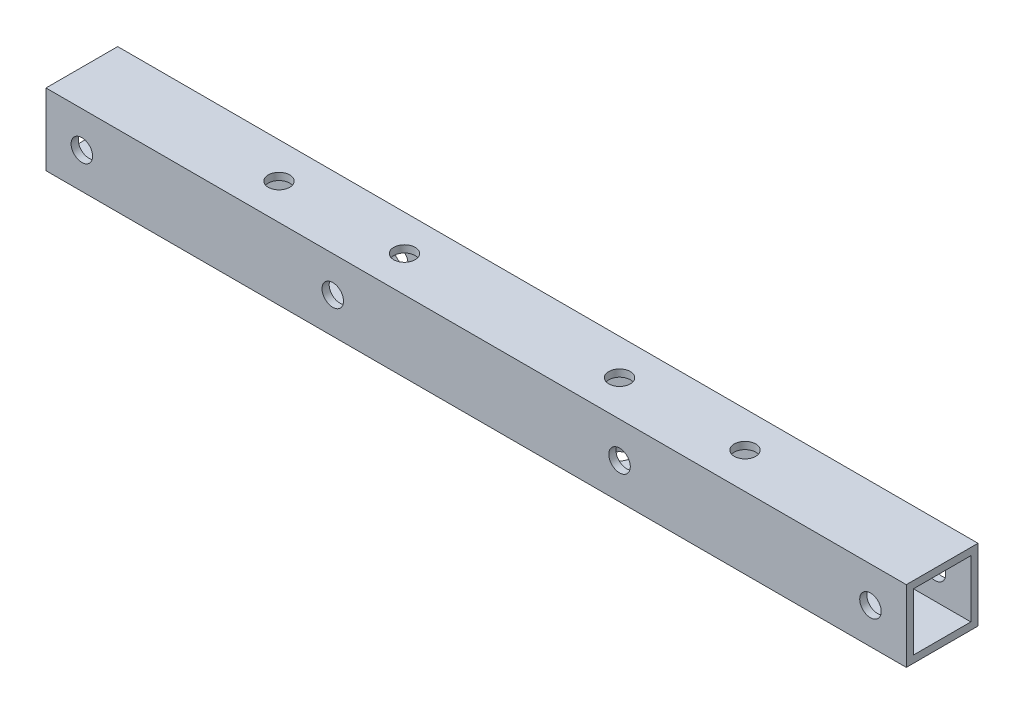
ISO-10303-21;
HEADER;
FILE_DESCRIPTION(('STEP AP214'),'2;1');
FILE_NAME('part.step','',(''),(''),'','','');
FILE_SCHEMA(('AUTOMOTIVE_DESIGN { 1 0 10303 214 1 1 1 1 }'));
ENDSEC;
DATA;
#1=APPLICATION_CONTEXT('core data for automotive mechanical design processes');
#2=APPLICATION_PROTOCOL_DEFINITION('international standard','automotive_design',2000,#1);
#3=PRODUCT_CONTEXT('',#1,'mechanical');
#4=PRODUCT('Part','Part','',(#3));
#5=PRODUCT_RELATED_PRODUCT_CATEGORY('part','',(#4));
#6=PRODUCT_DEFINITION_FORMATION('','',#4);
#7=PRODUCT_DEFINITION_CONTEXT('part definition',#1,'design');
#8=PRODUCT_DEFINITION('design','',#6,#7);
#9=PRODUCT_DEFINITION_SHAPE('','',#8);
#10=(LENGTH_UNIT() NAMED_UNIT(*) SI_UNIT(.MILLI.,.METRE.));
#11=(NAMED_UNIT(*) PLANE_ANGLE_UNIT() SI_UNIT($,.RADIAN.));
#12=(NAMED_UNIT(*) SI_UNIT($,.STERADIAN.) SOLID_ANGLE_UNIT());
#13=UNCERTAINTY_MEASURE_WITH_UNIT(LENGTH_MEASURE(1.E-05),#10,'distance_accuracy_value','');
#14=(GEOMETRIC_REPRESENTATION_CONTEXT(3) GLOBAL_UNCERTAINTY_ASSIGNED_CONTEXT((#13)) GLOBAL_UNIT_ASSIGNED_CONTEXT((#10,
#11,#12)) REPRESENTATION_CONTEXT('',''));
#15=CARTESIAN_POINT('',(0.,0.,0.));
#16=DIRECTION('',(0.,0.,1.));
#17=DIRECTION('',(1.,0.,0.));
#18=AXIS2_PLACEMENT_3D('',#15,#16,#17);
#19=CARTESIAN_POINT('',(120.,0.,0.));
#20=DIRECTION('',(1.,0.,0.));
#21=DIRECTION('',(0.,0.,-1.));
#22=AXIS2_PLACEMENT_3D('',#19,#20,#21);
#23=PLANE('',#22);
#24=DIRECTION('',(0.,1.,0.));
#25=VECTOR('',#24,1.);
#26=CARTESIAN_POINT('',(120.,-5.,-5.));
#27=LINE('',#26,#25);
#28=CARTESIAN_POINT('',(120.,-5.,-5.));
#29=VERTEX_POINT('',#28);
#30=CARTESIAN_POINT('',(120.,5.,-5.));
#31=VERTEX_POINT('',#30);
#32=EDGE_CURVE('E164',#29,#31,#27,.T.);
#33=ORIENTED_EDGE('',*,*,#32,.T.);
#34=DIRECTION('',(0.,0.,1.));
#35=VECTOR('',#34,1.);
#36=CARTESIAN_POINT('',(120.,5.,5.));
#37=LINE('',#36,#35);
#38=CARTESIAN_POINT('',(120.,5.,5.));
#39=VERTEX_POINT('',#38);
#40=EDGE_CURVE('E167',#31,#39,#37,.T.);
#41=ORIENTED_EDGE('',*,*,#40,.T.);
#42=DIRECTION('',(0.,-1.,0.));
#43=VECTOR('',#42,1.);
#44=CARTESIAN_POINT('',(120.,-5.,5.));
#45=LINE('',#44,#43);
#46=CARTESIAN_POINT('',(120.,-5.,5.));
#47=VERTEX_POINT('',#46);
#48=EDGE_CURVE('E170',#39,#47,#45,.T.);
#49=ORIENTED_EDGE('',*,*,#48,.T.);
#50=DIRECTION('',(0.,0.,-1.));
#51=VECTOR('',#50,1.);
#52=CARTESIAN_POINT('',(120.,-5.,5.));
#53=LINE('',#52,#51);
#54=EDGE_CURVE('E172',#47,#29,#53,.T.);
#55=ORIENTED_EDGE('',*,*,#54,.T.);
#56=EDGE_LOOP('',(#33,#41,#49,#55));
#57=FACE_BOUND('',#56,.T.);
#58=DIRECTION('',(0.,0.,1.));
#59=VECTOR('',#58,1.);
#60=CARTESIAN_POINT('',(120.,4.,0.));
#61=LINE('',#60,#59);
#62=CARTESIAN_POINT('',(120.,4.,-4.));
#63=VERTEX_POINT('',#62);
#64=CARTESIAN_POINT('',(120.,4.,4.));
#65=VERTEX_POINT('',#64);
#66=EDGE_CURVE('E134',#63,#65,#61,.T.);
#67=ORIENTED_EDGE('',*,*,#66,.F.);
#68=DIRECTION('',(0.,1.,0.));
#69=VECTOR('',#68,1.);
#70=CARTESIAN_POINT('',(120.,0.,-4.));
#71=LINE('',#70,#69);
#72=CARTESIAN_POINT('',(120.,-4.,-4.));
#73=VERTEX_POINT('',#72);
#74=EDGE_CURVE('E126',#73,#63,#71,.T.);
#75=ORIENTED_EDGE('',*,*,#74,.F.);
#76=DIRECTION('',(0.,0.,-1.));
#77=VECTOR('',#76,1.);
#78=CARTESIAN_POINT('',(120.,-4.,0.));
#79=LINE('',#78,#77);
#80=CARTESIAN_POINT('',(120.,-4.,4.));
#81=VERTEX_POINT('',#80);
#82=EDGE_CURVE('E148',#81,#73,#79,.T.);
#83=ORIENTED_EDGE('',*,*,#82,.F.);
#84=DIRECTION('',(0.,-1.,0.));
#85=VECTOR('',#84,1.);
#86=CARTESIAN_POINT('',(120.,0.,4.));
#87=LINE('',#86,#85);
#88=EDGE_CURVE('E146',#65,#81,#87,.T.);
#89=ORIENTED_EDGE('',*,*,#88,.F.);
#90=EDGE_LOOP('',(#67,#75,#83,#89));
#91=FACE_BOUND('',#90,.T.);
#92=ADVANCED_FACE('F59',(#57,#91),#23,.T.);
#93=CARTESIAN_POINT('',(0.,0.,0.));
#94=DIRECTION('',(1.,0.,0.));
#95=DIRECTION('',(0.,0.,-1.));
#96=AXIS2_PLACEMENT_3D('',#93,#94,#95);
#97=PLANE('',#96);
#98=DIRECTION('',(0.,1.,0.));
#99=VECTOR('',#98,1.);
#100=CARTESIAN_POINT('',(0.,-5.,-5.));
#101=LINE('',#100,#99);
#102=CARTESIAN_POINT('',(0.,-5.,-5.));
#103=VERTEX_POINT('',#102);
#104=CARTESIAN_POINT('',(0.,5.,-5.));
#105=VERTEX_POINT('',#104);
#106=EDGE_CURVE('E142',#103,#105,#101,.T.);
#107=ORIENTED_EDGE('',*,*,#106,.F.);
#108=DIRECTION('',(0.,0.,-1.));
#109=VECTOR('',#108,1.);
#110=CARTESIAN_POINT('',(0.,-5.,5.));
#111=LINE('',#110,#109);
#112=CARTESIAN_POINT('',(0.,-5.,5.));
#113=VERTEX_POINT('',#112);
#114=EDGE_CURVE('E168',#113,#103,#111,.T.);
#115=ORIENTED_EDGE('',*,*,#114,.F.);
#116=DIRECTION('',(0.,-1.,0.));
#117=VECTOR('',#116,1.);
#118=CARTESIAN_POINT('',(0.,-5.,5.));
#119=LINE('',#118,#117);
#120=CARTESIAN_POINT('',(0.,5.,5.));
#121=VERTEX_POINT('',#120);
#122=EDGE_CURVE('E179',#121,#113,#119,.T.);
#123=ORIENTED_EDGE('',*,*,#122,.F.);
#124=DIRECTION('',(0.,0.,1.));
#125=VECTOR('',#124,1.);
#126=CARTESIAN_POINT('',(0.,5.,5.));
#127=LINE('',#126,#125);
#128=EDGE_CURVE('E177',#105,#121,#127,.T.);
#129=ORIENTED_EDGE('',*,*,#128,.F.);
#130=EDGE_LOOP('',(#107,#115,#123,#129));
#131=FACE_BOUND('',#130,.T.);
#132=DIRECTION('',(0.,1.,0.));
#133=VECTOR('',#132,1.);
#134=CARTESIAN_POINT('',(0.,0.,-4.));
#135=LINE('',#134,#133);
#136=CARTESIAN_POINT('',(0.,-4.,-4.));
#137=VERTEX_POINT('',#136);
#138=CARTESIAN_POINT('',(0.,4.,-4.));
#139=VERTEX_POINT('',#138);
#140=EDGE_CURVE('E84',#137,#139,#135,.T.);
#141=ORIENTED_EDGE('',*,*,#140,.T.);
#142=DIRECTION('',(0.,0.,1.));
#143=VECTOR('',#142,1.);
#144=CARTESIAN_POINT('',(0.,4.,0.));
#145=LINE('',#144,#143);
#146=CARTESIAN_POINT('',(0.,4.,4.));
#147=VERTEX_POINT('',#146);
#148=EDGE_CURVE('E141',#139,#147,#145,.T.);
#149=ORIENTED_EDGE('',*,*,#148,.T.);
#150=DIRECTION('',(0.,-1.,0.));
#151=VECTOR('',#150,1.);
#152=CARTESIAN_POINT('',(0.,0.,4.));
#153=LINE('',#152,#151);
#154=CARTESIAN_POINT('',(0.,-4.,4.));
#155=VERTEX_POINT('',#154);
#156=EDGE_CURVE('E156',#147,#155,#153,.T.);
#157=ORIENTED_EDGE('',*,*,#156,.T.);
#158=DIRECTION('',(0.,0.,-1.));
#159=VECTOR('',#158,1.);
#160=CARTESIAN_POINT('',(0.,-4.,0.));
#161=LINE('',#160,#159);
#162=EDGE_CURVE('E135',#155,#137,#161,.T.);
#163=ORIENTED_EDGE('',*,*,#162,.T.);
#164=EDGE_LOOP('',(#141,#149,#157,#163));
#165=FACE_BOUND('',#164,.T.);
#166=ADVANCED_FACE('F286',(#131,#165),#97,.F.);
#167=CARTESIAN_POINT('',(120.,-5.,-5.));
#168=DIRECTION('',(0.,0.,1.));
#169=DIRECTION('',(1.,0.,0.));
#170=AXIS2_PLACEMENT_3D('',#167,#168,#169);
#171=PLANE('',#170);
#172=CARTESIAN_POINT('',(5.,0.,-5.));
#173=DIRECTION('',(0.,0.,1.));
#174=DIRECTION('',(1.,0.,0.));
#175=AXIS2_PLACEMENT_3D('',#172,#173,#174);
#176=CIRCLE('',#175,1.5);
#177=CARTESIAN_POINT('',(6.5,0.,-5.));
#178=VERTEX_POINT('',#177);
#179=EDGE_CURVE('E193',#178,#178,#176,.T.);
#180=ORIENTED_EDGE('',*,*,#179,.T.);
#181=EDGE_LOOP('',(#180));
#182=FACE_BOUND('',#181,.T.);
#183=CARTESIAN_POINT('',(80.,0.,-5.));
#184=DIRECTION('',(0.,0.,1.));
#185=DIRECTION('',(-1.,0.,0.));
#186=AXIS2_PLACEMENT_3D('',#183,#184,#185);
#187=CIRCLE('',#186,1.5);
#188=CARTESIAN_POINT('',(78.5,0.,-5.));
#189=VERTEX_POINT('',#188);
#190=EDGE_CURVE('E237',#189,#189,#187,.T.);
#191=ORIENTED_EDGE('',*,*,#190,.T.);
#192=EDGE_LOOP('',(#191));
#193=FACE_BOUND('',#192,.T.);
#194=CARTESIAN_POINT('',(40.,0.,-5.));
#195=DIRECTION('',(0.,0.,1.));
#196=DIRECTION('',(1.,0.,0.));
#197=AXIS2_PLACEMENT_3D('',#194,#195,#196);
#198=CIRCLE('',#197,1.5);
#199=CARTESIAN_POINT('',(41.5,0.,-5.));
#200=VERTEX_POINT('',#199);
#201=EDGE_CURVE('E248',#200,#200,#198,.T.);
#202=ORIENTED_EDGE('',*,*,#201,.T.);
#203=EDGE_LOOP('',(#202));
#204=FACE_BOUND('',#203,.T.);
#205=CARTESIAN_POINT('',(115.,0.,-5.));
#206=DIRECTION('',(0.,0.,1.));
#207=DIRECTION('',(-1.,0.,0.));
#208=AXIS2_PLACEMENT_3D('',#205,#206,#207);
#209=CIRCLE('',#208,1.5);
#210=CARTESIAN_POINT('',(113.5,0.,-5.));
#211=VERTEX_POINT('',#210);
#212=EDGE_CURVE('E236',#211,#211,#209,.T.);
#213=ORIENTED_EDGE('',*,*,#212,.T.);
#214=EDGE_LOOP('',(#213));
#215=FACE_BOUND('',#214,.T.);
#216=ORIENTED_EDGE('',*,*,#106,.T.);
#217=DIRECTION('',(-1.,0.,0.));
#218=VECTOR('',#217,1.);
#219=CARTESIAN_POINT('',(120.,5.,-5.));
#220=LINE('',#219,#218);
#221=EDGE_CURVE('E12',#31,#105,#220,.T.);
#222=ORIENTED_EDGE('',*,*,#221,.F.);
#223=ORIENTED_EDGE('',*,*,#32,.F.);
#224=DIRECTION('',(-1.,0.,0.));
#225=VECTOR('',#224,1.);
#226=CARTESIAN_POINT('',(120.,-5.,-5.));
#227=LINE('',#226,#225);
#228=EDGE_CURVE('E174',#29,#103,#227,.T.);
#229=ORIENTED_EDGE('',*,*,#228,.T.);
#230=EDGE_LOOP('',(#216,#222,#223,#229));
#231=FACE_BOUND('',#230,.T.);
#232=ADVANCED_FACE('F61',(#182,#193,#204,#215,#231),#171,.F.);
#233=CARTESIAN_POINT('',(120.,5.,5.));
#234=DIRECTION('',(0.,-1.,0.));
#235=DIRECTION('',(0.,0.,-1.));
#236=AXIS2_PLACEMENT_3D('',#233,#234,#235);
#237=PLANE('',#236);
#238=CARTESIAN_POINT('',(27.5,5.,0.));
#239=DIRECTION('',(0.,1.,0.));
#240=DIRECTION('',(0.,0.,1.));
#241=AXIS2_PLACEMENT_3D('',#238,#239,#240);
#242=CIRCLE('',#241,1.5);
#243=CARTESIAN_POINT('',(27.5,5.,1.5));
#244=VERTEX_POINT('',#243);
#245=EDGE_CURVE('E397',#244,#244,#242,.T.);
#246=ORIENTED_EDGE('',*,*,#245,.F.);
#247=EDGE_LOOP('',(#246));
#248=FACE_BOUND('',#247,.T.);
#249=CARTESIAN_POINT('',(75.,5.,0.));
#250=DIRECTION('',(0.,1.,0.));
#251=DIRECTION('',(0.,0.,-1.));
#252=AXIS2_PLACEMENT_3D('',#249,#250,#251);
#253=CIRCLE('',#252,1.5);
#254=CARTESIAN_POINT('',(75.,5.,-1.5));
#255=VERTEX_POINT('',#254);
#256=EDGE_CURVE('E389',#255,#255,#253,.T.);
#257=ORIENTED_EDGE('',*,*,#256,.F.);
#258=EDGE_LOOP('',(#257));
#259=FACE_BOUND('',#258,.T.);
#260=CARTESIAN_POINT('',(92.5,5.,0.));
#261=DIRECTION('',(0.,1.,0.));
#262=DIRECTION('',(0.,0.,-1.));
#263=AXIS2_PLACEMENT_3D('',#260,#261,#262);
#264=CIRCLE('',#263,1.5);
#265=CARTESIAN_POINT('',(92.5,5.,-1.50000000000001));
#266=VERTEX_POINT('',#265);
#267=EDGE_CURVE('E380',#266,#266,#264,.T.);
#268=ORIENTED_EDGE('',*,*,#267,.F.);
#269=EDGE_LOOP('',(#268));
#270=FACE_BOUND('',#269,.T.);
#271=CARTESIAN_POINT('',(45.,5.,0.));
#272=DIRECTION('',(0.,1.,0.));
#273=DIRECTION('',(0.,0.,1.));
#274=AXIS2_PLACEMENT_3D('',#271,#272,#273);
#275=CIRCLE('',#274,1.5);
#276=CARTESIAN_POINT('',(45.,5.,1.5));
#277=VERTEX_POINT('',#276);
#278=EDGE_CURVE('E386',#277,#277,#275,.T.);
#279=ORIENTED_EDGE('',*,*,#278,.F.);
#280=EDGE_LOOP('',(#279));
#281=FACE_BOUND('',#280,.T.);
#282=ORIENTED_EDGE('',*,*,#128,.T.);
#283=DIRECTION('',(-1.,0.,0.));
#284=VECTOR('',#283,1.);
#285=CARTESIAN_POINT('',(120.,5.,5.));
#286=LINE('',#285,#284);
#287=EDGE_CURVE('E68',#39,#121,#286,.T.);
#288=ORIENTED_EDGE('',*,*,#287,.F.);
#289=ORIENTED_EDGE('',*,*,#40,.F.);
#290=ORIENTED_EDGE('',*,*,#221,.T.);
#291=EDGE_LOOP('',(#282,#288,#289,#290));
#292=FACE_BOUND('',#291,.T.);
#293=ADVANCED_FACE('F285',(#248,#259,#270,#281,#292),#237,.F.);
#294=CARTESIAN_POINT('',(120.,-5.,5.));
#295=DIRECTION('',(0.,0.,-1.));
#296=DIRECTION('',(-1.,0.,0.));
#297=AXIS2_PLACEMENT_3D('',#294,#295,#296);
#298=PLANE('',#297);
#299=CARTESIAN_POINT('',(5.,0.,5.));
#300=DIRECTION('',(0.,0.,1.));
#301=DIRECTION('',(1.,0.,0.));
#302=AXIS2_PLACEMENT_3D('',#299,#300,#301);
#303=CIRCLE('',#302,1.5);
#304=CARTESIAN_POINT('',(6.5,0.,5.));
#305=VERTEX_POINT('',#304);
#306=EDGE_CURVE('E233',#305,#305,#303,.T.);
#307=ORIENTED_EDGE('',*,*,#306,.F.);
#308=EDGE_LOOP('',(#307));
#309=FACE_BOUND('',#308,.T.);
#310=CARTESIAN_POINT('',(80.,0.,5.));
#311=DIRECTION('',(0.,0.,1.));
#312=DIRECTION('',(-1.,0.,0.));
#313=AXIS2_PLACEMENT_3D('',#310,#311,#312);
#314=CIRCLE('',#313,1.5);
#315=CARTESIAN_POINT('',(78.5,0.,5.));
#316=VERTEX_POINT('',#315);
#317=EDGE_CURVE('E230',#316,#316,#314,.T.);
#318=ORIENTED_EDGE('',*,*,#317,.F.);
#319=EDGE_LOOP('',(#318));
#320=FACE_BOUND('',#319,.T.);
#321=CARTESIAN_POINT('',(40.,0.,5.));
#322=DIRECTION('',(0.,0.,1.));
#323=DIRECTION('',(1.,0.,0.));
#324=AXIS2_PLACEMENT_3D('',#321,#322,#323);
#325=CIRCLE('',#324,1.5);
#326=CARTESIAN_POINT('',(41.5,0.,5.));
#327=VERTEX_POINT('',#326);
#328=EDGE_CURVE('E240',#327,#327,#325,.T.);
#329=ORIENTED_EDGE('',*,*,#328,.F.);
#330=EDGE_LOOP('',(#329));
#331=FACE_BOUND('',#330,.T.);
#332=CARTESIAN_POINT('',(115.,0.,5.));
#333=DIRECTION('',(0.,0.,1.));
#334=DIRECTION('',(-1.,0.,0.));
#335=AXIS2_PLACEMENT_3D('',#332,#333,#334);
#336=CIRCLE('',#335,1.5);
#337=CARTESIAN_POINT('',(113.5,0.,5.));
#338=VERTEX_POINT('',#337);
#339=EDGE_CURVE('E245',#338,#338,#336,.T.);
#340=ORIENTED_EDGE('',*,*,#339,.F.);
#341=EDGE_LOOP('',(#340));
#342=FACE_BOUND('',#341,.T.);
#343=ORIENTED_EDGE('',*,*,#122,.T.);
#344=DIRECTION('',(-1.,0.,0.));
#345=VECTOR('',#344,1.);
#346=CARTESIAN_POINT('',(120.,-5.,5.));
#347=LINE('',#346,#345);
#348=EDGE_CURVE('E184',#47,#113,#347,.T.);
#349=ORIENTED_EDGE('',*,*,#348,.F.);
#350=ORIENTED_EDGE('',*,*,#48,.F.);
#351=ORIENTED_EDGE('',*,*,#287,.T.);
#352=EDGE_LOOP('',(#343,#349,#350,#351));
#353=FACE_BOUND('',#352,.T.);
#354=ADVANCED_FACE('F304',(#309,#320,#331,#342,#353),#298,.F.);
#355=CARTESIAN_POINT('',(120.,-5.,5.));
#356=DIRECTION('',(0.,1.,0.));
#357=DIRECTION('',(0.,0.,1.));
#358=AXIS2_PLACEMENT_3D('',#355,#356,#357);
#359=PLANE('',#358);
#360=CARTESIAN_POINT('',(27.5,-5.,0.));
#361=DIRECTION('',(0.,1.,0.));
#362=DIRECTION('',(0.,0.,1.));
#363=AXIS2_PLACEMENT_3D('',#360,#361,#362);
#364=CIRCLE('',#363,1.5);
#365=CARTESIAN_POINT('',(27.5,-5.,1.5));
#366=VERTEX_POINT('',#365);
#367=EDGE_CURVE('E394',#366,#366,#364,.T.);
#368=ORIENTED_EDGE('',*,*,#367,.T.);
#369=EDGE_LOOP('',(#368));
#370=FACE_BOUND('',#369,.T.);
#371=CARTESIAN_POINT('',(75.,-5.,0.));
#372=DIRECTION('',(0.,1.,0.));
#373=DIRECTION('',(0.,0.,-1.));
#374=AXIS2_PLACEMENT_3D('',#371,#372,#373);
#375=CIRCLE('',#374,1.5);
#376=CARTESIAN_POINT('',(75.,-5.,-1.5));
#377=VERTEX_POINT('',#376);
#378=EDGE_CURVE('E383',#377,#377,#375,.T.);
#379=ORIENTED_EDGE('',*,*,#378,.T.);
#380=EDGE_LOOP('',(#379));
#381=FACE_BOUND('',#380,.T.);
#382=CARTESIAN_POINT('',(92.5,-5.,0.));
#383=DIRECTION('',(0.,1.,0.));
#384=DIRECTION('',(0.,0.,-1.));
#385=AXIS2_PLACEMENT_3D('',#382,#383,#384);
#386=CIRCLE('',#385,1.5);
#387=CARTESIAN_POINT('',(92.5,-5.,-1.50000000000001));
#388=VERTEX_POINT('',#387);
#389=EDGE_CURVE('E382',#388,#388,#386,.T.);
#390=ORIENTED_EDGE('',*,*,#389,.T.);
#391=EDGE_LOOP('',(#390));
#392=FACE_BOUND('',#391,.T.);
#393=CARTESIAN_POINT('',(45.,-5.,0.));
#394=DIRECTION('',(0.,1.,0.));
#395=DIRECTION('',(0.,0.,1.));
#396=AXIS2_PLACEMENT_3D('',#393,#394,#395);
#397=CIRCLE('',#396,1.5);
#398=CARTESIAN_POINT('',(45.,-5.,1.5));
#399=VERTEX_POINT('',#398);
#400=EDGE_CURVE('E209',#399,#399,#397,.T.);
#401=ORIENTED_EDGE('',*,*,#400,.T.);
#402=EDGE_LOOP('',(#401));
#403=FACE_BOUND('',#402,.T.);
#404=ORIENTED_EDGE('',*,*,#114,.T.);
#405=ORIENTED_EDGE('',*,*,#228,.F.);
#406=ORIENTED_EDGE('',*,*,#54,.F.);
#407=ORIENTED_EDGE('',*,*,#348,.T.);
#408=EDGE_LOOP('',(#404,#405,#406,#407));
#409=FACE_BOUND('',#408,.T.);
#410=ADVANCED_FACE('F266',(#370,#381,#392,#403,#409),#359,.F.);
#411=CARTESIAN_POINT('',(120.,0.,-4.));
#412=DIRECTION('',(0.,0.,1.));
#413=DIRECTION('',(1.,0.,0.));
#414=AXIS2_PLACEMENT_3D('',#411,#412,#413);
#415=PLANE('',#414);
#416=CARTESIAN_POINT('',(5.,0.,-4.));
#417=DIRECTION('',(0.,0.,1.));
#418=DIRECTION('',(1.,0.,0.));
#419=AXIS2_PLACEMENT_3D('',#416,#417,#418);
#420=CIRCLE('',#419,1.5);
#421=CARTESIAN_POINT('',(6.5,0.,-4.));
#422=VERTEX_POINT('',#421);
#423=EDGE_CURVE('E154',#422,#422,#420,.T.);
#424=ORIENTED_EDGE('',*,*,#423,.F.);
#425=EDGE_LOOP('',(#424));
#426=FACE_BOUND('',#425,.T.);
#427=CARTESIAN_POINT('',(80.,0.,-4.));
#428=DIRECTION('',(0.,0.,1.));
#429=DIRECTION('',(1.,0.,0.));
#430=AXIS2_PLACEMENT_3D('',#427,#428,#429);
#431=CIRCLE('',#430,1.5);
#432=CARTESIAN_POINT('',(81.5,0.,-4.));
#433=VERTEX_POINT('',#432);
#434=EDGE_CURVE('E201',#433,#433,#431,.T.);
#435=ORIENTED_EDGE('',*,*,#434,.F.);
#436=EDGE_LOOP('',(#435));
#437=FACE_BOUND('',#436,.T.);
#438=CARTESIAN_POINT('',(40.,0.,-4.));
#439=DIRECTION('',(0.,0.,1.));
#440=DIRECTION('',(1.,0.,0.));
#441=AXIS2_PLACEMENT_3D('',#438,#439,#440);
#442=CIRCLE('',#441,1.5);
#443=CARTESIAN_POINT('',(41.5,0.,-4.));
#444=VERTEX_POINT('',#443);
#445=EDGE_CURVE('E197',#444,#444,#442,.T.);
#446=ORIENTED_EDGE('',*,*,#445,.F.);
#447=EDGE_LOOP('',(#446));
#448=FACE_BOUND('',#447,.T.);
#449=CARTESIAN_POINT('',(115.,0.,-4.));
#450=DIRECTION('',(0.,0.,1.));
#451=DIRECTION('',(1.,0.,0.));
#452=AXIS2_PLACEMENT_3D('',#449,#450,#451);
#453=CIRCLE('',#452,1.5);
#454=CARTESIAN_POINT('',(116.5,0.,-4.));
#455=VERTEX_POINT('',#454);
#456=EDGE_CURVE('E192',#455,#455,#453,.T.);
#457=ORIENTED_EDGE('',*,*,#456,.F.);
#458=EDGE_LOOP('',(#457));
#459=FACE_BOUND('',#458,.T.);
#460=ORIENTED_EDGE('',*,*,#140,.F.);
#461=DIRECTION('',(-1.,0.,0.));
#462=VECTOR('',#461,1.);
#463=CARTESIAN_POINT('',(120.,-4.,-4.));
#464=LINE('',#463,#462);
#465=EDGE_CURVE('E130',#73,#137,#464,.T.);
#466=ORIENTED_EDGE('',*,*,#465,.F.);
#467=ORIENTED_EDGE('',*,*,#74,.T.);
#468=DIRECTION('',(-1.,0.,0.));
#469=VECTOR('',#468,1.);
#470=CARTESIAN_POINT('',(120.,4.,-4.));
#471=LINE('',#470,#469);
#472=EDGE_CURVE('E129',#63,#139,#471,.T.);
#473=ORIENTED_EDGE('',*,*,#472,.T.);
#474=EDGE_LOOP('',(#460,#466,#467,#473));
#475=FACE_BOUND('',#474,.T.);
#476=ADVANCED_FACE('F128',(#426,#437,#448,#459,#475),#415,.T.);
#477=CARTESIAN_POINT('',(120.,4.,0.));
#478=DIRECTION('',(0.,-1.,0.));
#479=DIRECTION('',(0.,0.,-1.));
#480=AXIS2_PLACEMENT_3D('',#477,#478,#479);
#481=PLANE('',#480);
#482=CARTESIAN_POINT('',(27.5,4.,0.));
#483=DIRECTION('',(0.,-1.,0.));
#484=DIRECTION('',(0.,0.,-1.));
#485=AXIS2_PLACEMENT_3D('',#482,#483,#484);
#486=CIRCLE('',#485,1.5);
#487=CARTESIAN_POINT('',(27.5,4.,-1.5));
#488=VERTEX_POINT('',#487);
#489=EDGE_CURVE('E227',#488,#488,#486,.T.);
#490=ORIENTED_EDGE('',*,*,#489,.F.);
#491=EDGE_LOOP('',(#490));
#492=FACE_BOUND('',#491,.T.);
#493=CARTESIAN_POINT('',(75.,4.,0.));
#494=DIRECTION('',(0.,-1.,0.));
#495=DIRECTION('',(0.,0.,-1.));
#496=AXIS2_PLACEMENT_3D('',#493,#494,#495);
#497=CIRCLE('',#496,1.5);
#498=CARTESIAN_POINT('',(75.,4.,-1.5));
#499=VERTEX_POINT('',#498);
#500=EDGE_CURVE('E215',#499,#499,#497,.T.);
#501=ORIENTED_EDGE('',*,*,#500,.F.);
#502=EDGE_LOOP('',(#501));
#503=FACE_BOUND('',#502,.T.);
#504=CARTESIAN_POINT('',(92.5,4.,0.));
#505=DIRECTION('',(0.,-1.,0.));
#506=DIRECTION('',(0.,0.,-1.));
#507=AXIS2_PLACEMENT_3D('',#504,#505,#506);
#508=CIRCLE('',#507,1.5);
#509=CARTESIAN_POINT('',(92.5,4.,-1.50000000000001));
#510=VERTEX_POINT('',#509);
#511=EDGE_CURVE('E212',#510,#510,#508,.T.);
#512=ORIENTED_EDGE('',*,*,#511,.F.);
#513=EDGE_LOOP('',(#512));
#514=FACE_BOUND('',#513,.T.);
#515=CARTESIAN_POINT('',(45.,4.,0.));
#516=DIRECTION('',(0.,-1.,0.));
#517=DIRECTION('',(0.,0.,-1.));
#518=AXIS2_PLACEMENT_3D('',#515,#516,#517);
#519=CIRCLE('',#518,1.5);
#520=CARTESIAN_POINT('',(45.,4.,-1.5));
#521=VERTEX_POINT('',#520);
#522=EDGE_CURVE('E208',#521,#521,#519,.T.);
#523=ORIENTED_EDGE('',*,*,#522,.F.);
#524=EDGE_LOOP('',(#523));
#525=FACE_BOUND('',#524,.T.);
#526=ORIENTED_EDGE('',*,*,#148,.F.);
#527=ORIENTED_EDGE('',*,*,#472,.F.);
#528=ORIENTED_EDGE('',*,*,#66,.T.);
#529=DIRECTION('',(-1.,0.,0.));
#530=VECTOR('',#529,1.);
#531=CARTESIAN_POINT('',(120.,4.,4.));
#532=LINE('',#531,#530);
#533=EDGE_CURVE('E143',#65,#147,#532,.T.);
#534=ORIENTED_EDGE('',*,*,#533,.T.);
#535=EDGE_LOOP('',(#526,#527,#528,#534));
#536=FACE_BOUND('',#535,.T.);
#537=ADVANCED_FACE('F138',(#492,#503,#514,#525,#536),#481,.T.);
#538=CARTESIAN_POINT('',(120.,0.,4.));
#539=DIRECTION('',(0.,0.,-1.));
#540=DIRECTION('',(-1.,0.,0.));
#541=AXIS2_PLACEMENT_3D('',#538,#539,#540);
#542=PLANE('',#541);
#543=CARTESIAN_POINT('',(5.,0.,4.));
#544=DIRECTION('',(0.,0.,-1.));
#545=DIRECTION('',(-1.,0.,0.));
#546=AXIS2_PLACEMENT_3D('',#543,#544,#545);
#547=CIRCLE('',#546,1.5);
#548=CARTESIAN_POINT('',(3.5,0.,4.));
#549=VERTEX_POINT('',#548);
#550=EDGE_CURVE('E202',#549,#549,#547,.T.);
#551=ORIENTED_EDGE('',*,*,#550,.F.);
#552=EDGE_LOOP('',(#551));
#553=FACE_BOUND('',#552,.T.);
#554=CARTESIAN_POINT('',(80.,0.,4.));
#555=DIRECTION('',(0.,0.,-1.));
#556=DIRECTION('',(-1.,0.,0.));
#557=AXIS2_PLACEMENT_3D('',#554,#555,#556);
#558=CIRCLE('',#557,1.5);
#559=CARTESIAN_POINT('',(78.5,0.,4.));
#560=VERTEX_POINT('',#559);
#561=EDGE_CURVE('E198',#560,#560,#558,.T.);
#562=ORIENTED_EDGE('',*,*,#561,.F.);
#563=EDGE_LOOP('',(#562));
#564=FACE_BOUND('',#563,.T.);
#565=CARTESIAN_POINT('',(40.,0.,4.));
#566=DIRECTION('',(0.,0.,-1.));
#567=DIRECTION('',(-1.,0.,0.));
#568=AXIS2_PLACEMENT_3D('',#565,#566,#567);
#569=CIRCLE('',#568,1.5);
#570=CARTESIAN_POINT('',(38.5,0.,4.));
#571=VERTEX_POINT('',#570);
#572=EDGE_CURVE('E194',#571,#571,#569,.T.);
#573=ORIENTED_EDGE('',*,*,#572,.F.);
#574=EDGE_LOOP('',(#573));
#575=FACE_BOUND('',#574,.T.);
#576=CARTESIAN_POINT('',(115.,0.,4.));
#577=DIRECTION('',(0.,0.,-1.));
#578=DIRECTION('',(-1.,0.,0.));
#579=AXIS2_PLACEMENT_3D('',#576,#577,#578);
#580=CIRCLE('',#579,1.5);
#581=CARTESIAN_POINT('',(113.5,0.,4.));
#582=VERTEX_POINT('',#581);
#583=EDGE_CURVE('E189',#582,#582,#580,.T.);
#584=ORIENTED_EDGE('',*,*,#583,.F.);
#585=EDGE_LOOP('',(#584));
#586=FACE_BOUND('',#585,.T.);
#587=ORIENTED_EDGE('',*,*,#156,.F.);
#588=ORIENTED_EDGE('',*,*,#533,.F.);
#589=ORIENTED_EDGE('',*,*,#88,.T.);
#590=DIRECTION('',(-1.,0.,0.));
#591=VECTOR('',#590,1.);
#592=CARTESIAN_POINT('',(120.,-4.,4.));
#593=LINE('',#592,#591);
#594=EDGE_CURVE('E76',#81,#155,#593,.T.);
#595=ORIENTED_EDGE('',*,*,#594,.T.);
#596=EDGE_LOOP('',(#587,#588,#589,#595));
#597=FACE_BOUND('',#596,.T.);
#598=ADVANCED_FACE('F326',(#553,#564,#575,#586,#597),#542,.T.);
#599=CARTESIAN_POINT('',(120.,-4.,0.));
#600=DIRECTION('',(0.,1.,0.));
#601=DIRECTION('',(0.,0.,1.));
#602=AXIS2_PLACEMENT_3D('',#599,#600,#601);
#603=PLANE('',#602);
#604=CARTESIAN_POINT('',(27.5,-4.,0.));
#605=DIRECTION('',(0.,1.,0.));
#606=DIRECTION('',(0.,0.,1.));
#607=AXIS2_PLACEMENT_3D('',#604,#605,#606);
#608=CIRCLE('',#607,1.5);
#609=CARTESIAN_POINT('',(27.5,-4.,1.5));
#610=VERTEX_POINT('',#609);
#611=EDGE_CURVE('E63',#610,#610,#608,.T.);
#612=ORIENTED_EDGE('',*,*,#611,.F.);
#613=EDGE_LOOP('',(#612));
#614=FACE_BOUND('',#613,.T.);
#615=CARTESIAN_POINT('',(75.,-4.,0.));
#616=DIRECTION('',(0.,1.,0.));
#617=DIRECTION('',(0.,0.,1.));
#618=AXIS2_PLACEMENT_3D('',#615,#616,#617);
#619=CIRCLE('',#618,1.5);
#620=CARTESIAN_POINT('',(75.,-4.,1.49999999999999));
#621=VERTEX_POINT('',#620);
#622=EDGE_CURVE('E213',#621,#621,#619,.T.);
#623=ORIENTED_EDGE('',*,*,#622,.F.);
#624=EDGE_LOOP('',(#623));
#625=FACE_BOUND('',#624,.T.);
#626=CARTESIAN_POINT('',(92.5,-4.,0.));
#627=DIRECTION('',(0.,1.,0.));
#628=DIRECTION('',(0.,0.,1.));
#629=AXIS2_PLACEMENT_3D('',#626,#627,#628);
#630=CIRCLE('',#629,1.5);
#631=CARTESIAN_POINT('',(92.5,-4.,1.49999999999999));
#632=VERTEX_POINT('',#631);
#633=EDGE_CURVE('E210',#632,#632,#630,.T.);
#634=ORIENTED_EDGE('',*,*,#633,.F.);
#635=EDGE_LOOP('',(#634));
#636=FACE_BOUND('',#635,.T.);
#637=CARTESIAN_POINT('',(45.,-4.,0.));
#638=DIRECTION('',(0.,1.,0.));
#639=DIRECTION('',(0.,0.,1.));
#640=AXIS2_PLACEMENT_3D('',#637,#638,#639);
#641=CIRCLE('',#640,1.5);
#642=CARTESIAN_POINT('',(45.,-4.,1.5));
#643=VERTEX_POINT('',#642);
#644=EDGE_CURVE('E205',#643,#643,#641,.T.);
#645=ORIENTED_EDGE('',*,*,#644,.F.);
#646=EDGE_LOOP('',(#645));
#647=FACE_BOUND('',#646,.T.);
#648=ORIENTED_EDGE('',*,*,#162,.F.);
#649=ORIENTED_EDGE('',*,*,#594,.F.);
#650=ORIENTED_EDGE('',*,*,#82,.T.);
#651=ORIENTED_EDGE('',*,*,#465,.T.);
#652=EDGE_LOOP('',(#648,#649,#650,#651));
#653=FACE_BOUND('',#652,.T.);
#654=ADVANCED_FACE('F330',(#614,#625,#636,#647,#653),#603,.T.);
#655=CARTESIAN_POINT('',(115.,0.,-5.));
#656=DIRECTION('',(0.,0.,1.));
#657=DIRECTION('',(1.,0.,0.));
#658=AXIS2_PLACEMENT_3D('',#655,#656,#657);
#659=CYLINDRICAL_SURFACE('',#658,1.5);
#660=ORIENTED_EDGE('',*,*,#583,.T.);
#661=EDGE_LOOP('',(#660));
#662=FACE_BOUND('',#661,.T.);
#663=ORIENTED_EDGE('',*,*,#339,.T.);
#664=EDGE_LOOP('',(#663));
#665=FACE_BOUND('',#664,.T.);
#666=ADVANCED_FACE('F280',(#662,#665),#659,.F.);
#667=CARTESIAN_POINT('',(40.,0.,-5.));
#668=DIRECTION('',(0.,0.,1.));
#669=DIRECTION('',(1.,0.,0.));
#670=AXIS2_PLACEMENT_3D('',#667,#668,#669);
#671=CYLINDRICAL_SURFACE('',#670,1.5);
#672=ORIENTED_EDGE('',*,*,#572,.T.);
#673=EDGE_LOOP('',(#672));
#674=FACE_BOUND('',#673,.T.);
#675=ORIENTED_EDGE('',*,*,#328,.T.);
#676=EDGE_LOOP('',(#675));
#677=FACE_BOUND('',#676,.T.);
#678=ADVANCED_FACE('F335',(#674,#677),#671,.F.);
#679=CARTESIAN_POINT('',(80.,0.,-5.));
#680=DIRECTION('',(0.,0.,1.));
#681=DIRECTION('',(1.,0.,0.));
#682=AXIS2_PLACEMENT_3D('',#679,#680,#681);
#683=CYLINDRICAL_SURFACE('',#682,1.5);
#684=ORIENTED_EDGE('',*,*,#561,.T.);
#685=EDGE_LOOP('',(#684));
#686=FACE_BOUND('',#685,.T.);
#687=ORIENTED_EDGE('',*,*,#317,.T.);
#688=EDGE_LOOP('',(#687));
#689=FACE_BOUND('',#688,.T.);
#690=ADVANCED_FACE('F337',(#686,#689),#683,.F.);
#691=CARTESIAN_POINT('',(5.,0.,-5.));
#692=DIRECTION('',(0.,0.,1.));
#693=DIRECTION('',(1.,0.,0.));
#694=AXIS2_PLACEMENT_3D('',#691,#692,#693);
#695=CYLINDRICAL_SURFACE('',#694,1.5);
#696=ORIENTED_EDGE('',*,*,#550,.T.);
#697=EDGE_LOOP('',(#696));
#698=FACE_BOUND('',#697,.T.);
#699=ORIENTED_EDGE('',*,*,#306,.T.);
#700=EDGE_LOOP('',(#699));
#701=FACE_BOUND('',#700,.T.);
#702=ADVANCED_FACE('F278',(#698,#701),#695,.F.);
#703=ORIENTED_EDGE('',*,*,#456,.T.);
#704=EDGE_LOOP('',(#703));
#705=FACE_BOUND('',#704,.T.);
#706=ORIENTED_EDGE('',*,*,#212,.F.);
#707=EDGE_LOOP('',(#706));
#708=FACE_BOUND('',#707,.T.);
#709=ADVANCED_FACE('F274',(#705,#708),#659,.F.);
#710=ORIENTED_EDGE('',*,*,#445,.T.);
#711=EDGE_LOOP('',(#710));
#712=FACE_BOUND('',#711,.T.);
#713=ORIENTED_EDGE('',*,*,#201,.F.);
#714=EDGE_LOOP('',(#713));
#715=FACE_BOUND('',#714,.T.);
#716=ADVANCED_FACE('F277',(#712,#715),#671,.F.);
#717=ORIENTED_EDGE('',*,*,#434,.T.);
#718=EDGE_LOOP('',(#717));
#719=FACE_BOUND('',#718,.T.);
#720=ORIENTED_EDGE('',*,*,#190,.F.);
#721=EDGE_LOOP('',(#720));
#722=FACE_BOUND('',#721,.T.);
#723=ADVANCED_FACE('F345',(#719,#722),#683,.F.);
#724=ORIENTED_EDGE('',*,*,#423,.T.);
#725=EDGE_LOOP('',(#724));
#726=FACE_BOUND('',#725,.T.);
#727=ORIENTED_EDGE('',*,*,#179,.F.);
#728=EDGE_LOOP('',(#727));
#729=FACE_BOUND('',#728,.T.);
#730=ADVANCED_FACE('F261',(#726,#729),#695,.F.);
#731=CARTESIAN_POINT('',(45.,-5.,0.));
#732=DIRECTION('',(0.,1.,0.));
#733=DIRECTION('',(0.,0.,1.));
#734=AXIS2_PLACEMENT_3D('',#731,#732,#733);
#735=CYLINDRICAL_SURFACE('',#734,1.5);
#736=ORIENTED_EDGE('',*,*,#644,.T.);
#737=EDGE_LOOP('',(#736));
#738=FACE_BOUND('',#737,.T.);
#739=ORIENTED_EDGE('',*,*,#400,.F.);
#740=EDGE_LOOP('',(#739));
#741=FACE_BOUND('',#740,.T.);
#742=ADVANCED_FACE('F349',(#738,#741),#735,.F.);
#743=CARTESIAN_POINT('',(92.5,-5.,0.));
#744=DIRECTION('',(0.,1.,0.));
#745=DIRECTION('',(0.,0.,1.));
#746=AXIS2_PLACEMENT_3D('',#743,#744,#745);
#747=CYLINDRICAL_SURFACE('',#746,1.5);
#748=ORIENTED_EDGE('',*,*,#633,.T.);
#749=EDGE_LOOP('',(#748));
#750=FACE_BOUND('',#749,.T.);
#751=ORIENTED_EDGE('',*,*,#389,.F.);
#752=EDGE_LOOP('',(#751));
#753=FACE_BOUND('',#752,.T.);
#754=ADVANCED_FACE('F352',(#750,#753),#747,.F.);
#755=CARTESIAN_POINT('',(75.,-5.,0.));
#756=DIRECTION('',(0.,1.,0.));
#757=DIRECTION('',(0.,0.,1.));
#758=AXIS2_PLACEMENT_3D('',#755,#756,#757);
#759=CYLINDRICAL_SURFACE('',#758,1.5);
#760=ORIENTED_EDGE('',*,*,#622,.T.);
#761=EDGE_LOOP('',(#760));
#762=FACE_BOUND('',#761,.T.);
#763=ORIENTED_EDGE('',*,*,#378,.F.);
#764=EDGE_LOOP('',(#763));
#765=FACE_BOUND('',#764,.T.);
#766=ADVANCED_FACE('F358',(#762,#765),#759,.F.);
#767=CARTESIAN_POINT('',(27.5,-5.,0.));
#768=DIRECTION('',(0.,1.,0.));
#769=DIRECTION('',(0.,0.,1.));
#770=AXIS2_PLACEMENT_3D('',#767,#768,#769);
#771=CYLINDRICAL_SURFACE('',#770,1.5);
#772=ORIENTED_EDGE('',*,*,#611,.T.);
#773=EDGE_LOOP('',(#772));
#774=FACE_BOUND('',#773,.T.);
#775=ORIENTED_EDGE('',*,*,#367,.F.);
#776=EDGE_LOOP('',(#775));
#777=FACE_BOUND('',#776,.T.);
#778=ADVANCED_FACE('F355',(#774,#777),#771,.F.);
#779=ORIENTED_EDGE('',*,*,#522,.T.);
#780=EDGE_LOOP('',(#779));
#781=FACE_BOUND('',#780,.T.);
#782=ORIENTED_EDGE('',*,*,#278,.T.);
#783=EDGE_LOOP('',(#782));
#784=FACE_BOUND('',#783,.T.);
#785=ADVANCED_FACE('F354',(#781,#784),#735,.F.);
#786=ORIENTED_EDGE('',*,*,#511,.T.);
#787=EDGE_LOOP('',(#786));
#788=FACE_BOUND('',#787,.T.);
#789=ORIENTED_EDGE('',*,*,#267,.T.);
#790=EDGE_LOOP('',(#789));
#791=FACE_BOUND('',#790,.T.);
#792=ADVANCED_FACE('F366',(#788,#791),#747,.F.);
#793=ORIENTED_EDGE('',*,*,#500,.T.);
#794=EDGE_LOOP('',(#793));
#795=FACE_BOUND('',#794,.T.);
#796=ORIENTED_EDGE('',*,*,#256,.T.);
#797=EDGE_LOOP('',(#796));
#798=FACE_BOUND('',#797,.T.);
#799=ADVANCED_FACE('F363',(#795,#798),#759,.F.);
#800=ORIENTED_EDGE('',*,*,#489,.T.);
#801=EDGE_LOOP('',(#800));
#802=FACE_BOUND('',#801,.T.);
#803=ORIENTED_EDGE('',*,*,#245,.T.);
#804=EDGE_LOOP('',(#803));
#805=FACE_BOUND('',#804,.T.);
#806=ADVANCED_FACE('F360',(#802,#805),#771,.F.);
#807=CLOSED_SHELL('',(#92,#166,#232,#293,#354,#410,#476,#537,#598,#654,#666,#678,#690,#702,#709,
#716,#723,#730,#742,#754,#766,#778,#785,#792,#799,#806));
#808=MANIFOLD_SOLID_BREP('B2',#807);
#809=ADVANCED_BREP_SHAPE_REPRESENTATION('',(#18,#808),#14);
#810=SHAPE_DEFINITION_REPRESENTATION(#9,#809);
ENDSEC;
END-ISO-10303-21;
